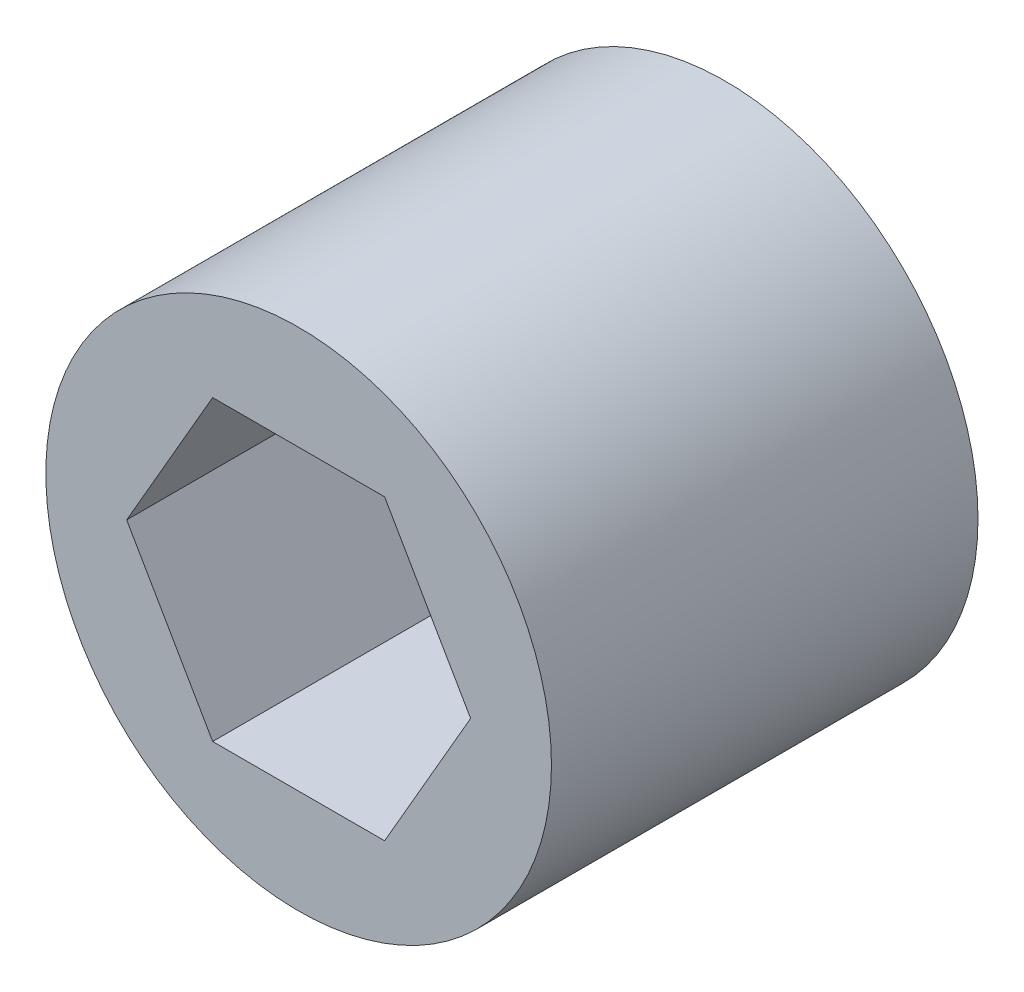
ISO-10303-21;
HEADER;
FILE_DESCRIPTION(('STEP AP214'),'2;1');
FILE_NAME('part.step','',(''),(''),'','','');
FILE_SCHEMA(('AUTOMOTIVE_DESIGN { 1 0 10303 214 1 1 1 1 }'));
ENDSEC;
DATA;
#1=APPLICATION_CONTEXT('core data for automotive mechanical design processes');
#2=APPLICATION_PROTOCOL_DEFINITION('international standard','automotive_design',2000,#1);
#3=PRODUCT_CONTEXT('',#1,'mechanical');
#4=PRODUCT('Part','Part','',(#3));
#5=PRODUCT_RELATED_PRODUCT_CATEGORY('part','',(#4));
#6=PRODUCT_DEFINITION_FORMATION('','',#4);
#7=PRODUCT_DEFINITION_CONTEXT('part definition',#1,'design');
#8=PRODUCT_DEFINITION('design','',#6,#7);
#9=PRODUCT_DEFINITION_SHAPE('','',#8);
#10=(LENGTH_UNIT() NAMED_UNIT(*) SI_UNIT(.MILLI.,.METRE.));
#11=(NAMED_UNIT(*) PLANE_ANGLE_UNIT() SI_UNIT($,.RADIAN.));
#12=(NAMED_UNIT(*) SI_UNIT($,.STERADIAN.) SOLID_ANGLE_UNIT());
#13=UNCERTAINTY_MEASURE_WITH_UNIT(LENGTH_MEASURE(1.E-05),#10,'distance_accuracy_value','');
#14=(GEOMETRIC_REPRESENTATION_CONTEXT(3) GLOBAL_UNCERTAINTY_ASSIGNED_CONTEXT((#13)) GLOBAL_UNIT_ASSIGNED_CONTEXT((#10,
#11,#12)) REPRESENTATION_CONTEXT('',''));
#15=CARTESIAN_POINT('',(0.,0.,0.));
#16=DIRECTION('',(0.,0.,1.));
#17=DIRECTION('',(1.,0.,0.));
#18=AXIS2_PLACEMENT_3D('',#15,#16,#17);
#19=CARTESIAN_POINT('',(0.,0.,14.732));
#20=DIRECTION('',(0.,0.,1.));
#21=DIRECTION('',(1.,0.,0.));
#22=AXIS2_PLACEMENT_3D('',#19,#20,#21);
#23=PLANE('',#22);
#24=CARTESIAN_POINT('',(0.,0.,14.732));
#25=DIRECTION('',(0.,0.,1.));
#26=DIRECTION('',(1.,0.,0.));
#27=AXIS2_PLACEMENT_3D('',#24,#25,#26);
#28=CIRCLE('',#27,8.73125);
#29=CARTESIAN_POINT('',(8.73125,0.,14.732));
#30=VERTEX_POINT('',#29);
#31=EDGE_CURVE('E11',#30,#30,#28,.T.);
#32=ORIENTED_EDGE('',*,*,#31,.T.);
#33=EDGE_LOOP('',(#32));
#34=FACE_BOUND('',#33,.T.);
#35=DIRECTION('',(-0.500000000000001,0.866025403784438,0.));
#36=VECTOR('',#35,1.);
#37=CARTESIAN_POINT('',(5.93920221915366,0.,14.732));
#38=LINE('',#37,#36);
#39=CARTESIAN_POINT('',(5.93920221915366,0.,14.732));
#40=VERTEX_POINT('',#39);
#41=CARTESIAN_POINT('',(2.96960110957682,5.14349999999999,14.732));
#42=VERTEX_POINT('',#41);
#43=EDGE_CURVE('E96',#40,#42,#38,.T.);
#44=ORIENTED_EDGE('',*,*,#43,.F.);
#45=DIRECTION('',(0.499999999999995,0.866025403784441,0.));
#46=VECTOR('',#45,1.);
#47=CARTESIAN_POINT('',(2.96960110957689,-5.14349999999995,14.732));
#48=LINE('',#47,#46);
#49=CARTESIAN_POINT('',(2.96960110957689,-5.14349999999995,14.732));
#50=VERTEX_POINT('',#49);
#51=EDGE_CURVE('E88',#50,#40,#48,.T.);
#52=ORIENTED_EDGE('',*,*,#51,.F.);
#53=DIRECTION('',(1.,0.,0.));
#54=VECTOR('',#53,1.);
#55=CARTESIAN_POINT('',(-2.96960110957678,-5.14350000000001,14.732));
#56=LINE('',#55,#54);
#57=CARTESIAN_POINT('',(-2.96960110957678,-5.14350000000001,14.732));
#58=VERTEX_POINT('',#57);
#59=EDGE_CURVE('E116',#58,#50,#56,.T.);
#60=ORIENTED_EDGE('',*,*,#59,.F.);
#61=DIRECTION('',(0.500000000000007,-0.866025403784434,0.));
#62=VECTOR('',#61,1.);
#63=CARTESIAN_POINT('',(-5.93920221915366,0.,14.732));
#64=LINE('',#63,#62);
#65=CARTESIAN_POINT('',(-5.93920221915366,0.,14.732));
#66=VERTEX_POINT('',#65);
#67=EDGE_CURVE('E114',#66,#58,#64,.T.);
#68=ORIENTED_EDGE('',*,*,#67,.F.);
#69=DIRECTION('',(-0.499999999999995,-0.866025403784441,0.));
#70=VECTOR('',#69,1.);
#71=CARTESIAN_POINT('',(-2.96960110957685,5.14349999999997,14.732));
#72=LINE('',#71,#70);
#73=CARTESIAN_POINT('',(-2.96960110957685,5.14349999999997,14.732));
#74=VERTEX_POINT('',#73);
#75=EDGE_CURVE('E110',#74,#66,#72,.T.);
#76=ORIENTED_EDGE('',*,*,#75,.F.);
#77=DIRECTION('',(-1.,0.,0.));
#78=VECTOR('',#77,1.);
#79=CARTESIAN_POINT('',(2.96960110957682,5.14349999999999,14.732));
#80=LINE('',#79,#78);
#81=EDGE_CURVE('E108',#42,#74,#80,.T.);
#82=ORIENTED_EDGE('',*,*,#81,.F.);
#83=EDGE_LOOP('',(#44,#52,#60,#68,#76,#82));
#84=FACE_BOUND('',#83,.T.);
#85=ADVANCED_FACE('F35',(#34,#84),#23,.T.);
#86=CARTESIAN_POINT('',(0.,0.,0.));
#87=DIRECTION('',(0.,0.,1.));
#88=DIRECTION('',(1.,0.,0.));
#89=AXIS2_PLACEMENT_3D('',#86,#87,#88);
#90=PLANE('',#89);
#91=CARTESIAN_POINT('',(0.,0.,0.));
#92=DIRECTION('',(0.,0.,1.));
#93=DIRECTION('',(1.,0.,0.));
#94=AXIS2_PLACEMENT_3D('',#91,#92,#93);
#95=CIRCLE('',#94,8.73125);
#96=CARTESIAN_POINT('',(8.73125,0.,0.));
#97=VERTEX_POINT('',#96);
#98=EDGE_CURVE('E39',#97,#97,#95,.T.);
#99=ORIENTED_EDGE('',*,*,#98,.F.);
#100=EDGE_LOOP('',(#99));
#101=FACE_BOUND('',#100,.T.);
#102=DIRECTION('',(0.499999999999995,0.866025403784441,0.));
#103=VECTOR('',#102,1.);
#104=CARTESIAN_POINT('',(2.96960110957689,-5.14349999999995,0.));
#105=LINE('',#104,#103);
#106=CARTESIAN_POINT('',(2.96960110957689,-5.14349999999995,0.));
#107=VERTEX_POINT('',#106);
#108=CARTESIAN_POINT('',(5.93920221915366,0.,0.));
#109=VERTEX_POINT('',#108);
#110=EDGE_CURVE('E58',#107,#109,#105,.T.);
#111=ORIENTED_EDGE('',*,*,#110,.T.);
#112=DIRECTION('',(-0.500000000000001,0.866025403784438,0.));
#113=VECTOR('',#112,1.);
#114=CARTESIAN_POINT('',(5.93920221915366,0.,0.));
#115=LINE('',#114,#113);
#116=CARTESIAN_POINT('',(2.96960110957682,5.14349999999999,0.));
#117=VERTEX_POINT('',#116);
#118=EDGE_CURVE('E103',#109,#117,#115,.T.);
#119=ORIENTED_EDGE('',*,*,#118,.T.);
#120=DIRECTION('',(-1.,0.,0.));
#121=VECTOR('',#120,1.);
#122=CARTESIAN_POINT('',(2.96960110957682,5.14349999999999,0.));
#123=LINE('',#122,#121);
#124=CARTESIAN_POINT('',(-2.96960110957685,5.14349999999997,0.));
#125=VERTEX_POINT('',#124);
#126=EDGE_CURVE('E120',#117,#125,#123,.T.);
#127=ORIENTED_EDGE('',*,*,#126,.T.);
#128=DIRECTION('',(-0.499999999999995,-0.866025403784441,0.));
#129=VECTOR('',#128,1.);
#130=CARTESIAN_POINT('',(-2.96960110957685,5.14349999999997,0.));
#131=LINE('',#130,#129);
#132=CARTESIAN_POINT('',(-5.93920221915366,0.,0.));
#133=VERTEX_POINT('',#132);
#134=EDGE_CURVE('E123',#125,#133,#131,.T.);
#135=ORIENTED_EDGE('',*,*,#134,.T.);
#136=DIRECTION('',(0.500000000000007,-0.866025403784434,0.));
#137=VECTOR('',#136,1.);
#138=CARTESIAN_POINT('',(-5.93920221915366,0.,0.));
#139=LINE('',#138,#137);
#140=CARTESIAN_POINT('',(-2.96960110957678,-5.14350000000001,0.));
#141=VERTEX_POINT('',#140);
#142=EDGE_CURVE('E126',#133,#141,#139,.T.);
#143=ORIENTED_EDGE('',*,*,#142,.T.);
#144=DIRECTION('',(1.,0.,0.));
#145=VECTOR('',#144,1.);
#146=CARTESIAN_POINT('',(-2.96960110957678,-5.14350000000001,0.));
#147=LINE('',#146,#145);
#148=EDGE_CURVE('E97',#141,#107,#147,.T.);
#149=ORIENTED_EDGE('',*,*,#148,.T.);
#150=EDGE_LOOP('',(#111,#119,#127,#135,#143,#149));
#151=FACE_BOUND('',#150,.T.);
#152=ADVANCED_FACE('F143',(#101,#151),#90,.F.);
#153=CARTESIAN_POINT('',(0.,0.,14.732));
#154=DIRECTION('',(0.,0.,-1.));
#155=DIRECTION('',(-1.,0.,0.));
#156=AXIS2_PLACEMENT_3D('',#153,#154,#155);
#157=CYLINDRICAL_SURFACE('',#156,8.73125);
#158=ORIENTED_EDGE('',*,*,#31,.F.);
#159=EDGE_LOOP('',(#158));
#160=FACE_BOUND('',#159,.T.);
#161=ORIENTED_EDGE('',*,*,#98,.T.);
#162=EDGE_LOOP('',(#161));
#163=FACE_BOUND('',#162,.T.);
#164=ADVANCED_FACE('F37',(#160,#163),#157,.T.);
#165=CARTESIAN_POINT('',(2.96960110957689,-5.14349999999995,14.732));
#166=DIRECTION('',(-0.866025403784442,0.499999999999995,0.));
#167=DIRECTION('',(-0.499999999999995,-0.866025403784441,0.));
#168=AXIS2_PLACEMENT_3D('',#165,#166,#167);
#169=PLANE('',#168);
#170=ORIENTED_EDGE('',*,*,#110,.F.);
#171=DIRECTION('',(0.,0.,-1.));
#172=VECTOR('',#171,1.);
#173=CARTESIAN_POINT('',(2.96960110957689,-5.14349999999995,14.732));
#174=LINE('',#173,#172);
#175=EDGE_CURVE('E92',#50,#107,#174,.T.);
#176=ORIENTED_EDGE('',*,*,#175,.F.);
#177=ORIENTED_EDGE('',*,*,#51,.T.);
#178=DIRECTION('',(0.,0.,-1.));
#179=VECTOR('',#178,1.);
#180=CARTESIAN_POINT('',(5.93920221915366,0.,14.732));
#181=LINE('',#180,#179);
#182=EDGE_CURVE('E91',#40,#109,#181,.T.);
#183=ORIENTED_EDGE('',*,*,#182,.T.);
#184=EDGE_LOOP('',(#170,#176,#177,#183));
#185=FACE_BOUND('',#184,.T.);
#186=ADVANCED_FACE('F90',(#185),#169,.T.);
#187=CARTESIAN_POINT('',(5.93920221915366,0.,14.732));
#188=DIRECTION('',(-0.866025403784438,-0.500000000000001,0.));
#189=DIRECTION('',(0.500000000000001,-0.866025403784438,0.));
#190=AXIS2_PLACEMENT_3D('',#187,#188,#189);
#191=PLANE('',#190);
#192=ORIENTED_EDGE('',*,*,#118,.F.);
#193=ORIENTED_EDGE('',*,*,#182,.F.);
#194=ORIENTED_EDGE('',*,*,#43,.T.);
#195=DIRECTION('',(0.,0.,-1.));
#196=VECTOR('',#195,1.);
#197=CARTESIAN_POINT('',(2.96960110957682,5.14349999999999,14.732));
#198=LINE('',#197,#196);
#199=EDGE_CURVE('E104',#42,#117,#198,.T.);
#200=ORIENTED_EDGE('',*,*,#199,.T.);
#201=EDGE_LOOP('',(#192,#193,#194,#200));
#202=FACE_BOUND('',#201,.T.);
#203=ADVANCED_FACE('F100',(#202),#191,.T.);
#204=CARTESIAN_POINT('',(2.96960110957682,5.14349999999999,14.732));
#205=DIRECTION('',(0.,-1.,0.));
#206=DIRECTION('',(1.,0.,0.));
#207=AXIS2_PLACEMENT_3D('',#204,#205,#206);
#208=PLANE('',#207);
#209=ORIENTED_EDGE('',*,*,#126,.F.);
#210=ORIENTED_EDGE('',*,*,#199,.F.);
#211=ORIENTED_EDGE('',*,*,#81,.T.);
#212=DIRECTION('',(0.,0.,-1.));
#213=VECTOR('',#212,1.);
#214=CARTESIAN_POINT('',(-2.96960110957685,5.14349999999997,14.732));
#215=LINE('',#214,#213);
#216=EDGE_CURVE('E135',#74,#125,#215,.T.);
#217=ORIENTED_EDGE('',*,*,#216,.T.);
#218=EDGE_LOOP('',(#209,#210,#211,#217));
#219=FACE_BOUND('',#218,.T.);
#220=ADVANCED_FACE('F139',(#219),#208,.T.);
#221=CARTESIAN_POINT('',(-2.96960110957685,5.14349999999997,14.732));
#222=DIRECTION('',(0.866025403784442,-0.499999999999995,0.));
#223=DIRECTION('',(0.499999999999995,0.866025403784441,0.));
#224=AXIS2_PLACEMENT_3D('',#221,#222,#223);
#225=PLANE('',#224);
#226=ORIENTED_EDGE('',*,*,#134,.F.);
#227=ORIENTED_EDGE('',*,*,#216,.F.);
#228=ORIENTED_EDGE('',*,*,#75,.T.);
#229=DIRECTION('',(0.,0.,-1.));
#230=VECTOR('',#229,1.);
#231=CARTESIAN_POINT('',(-5.93920221915366,0.,14.732));
#232=LINE('',#231,#230);
#233=EDGE_CURVE('E133',#66,#133,#232,.T.);
#234=ORIENTED_EDGE('',*,*,#233,.T.);
#235=EDGE_LOOP('',(#226,#227,#228,#234));
#236=FACE_BOUND('',#235,.T.);
#237=ADVANCED_FACE('F151',(#236),#225,.T.);
#238=CARTESIAN_POINT('',(-5.93920221915366,0.,14.732));
#239=DIRECTION('',(0.866025403784435,0.500000000000007,0.));
#240=DIRECTION('',(-0.500000000000007,0.866025403784435,0.));
#241=AXIS2_PLACEMENT_3D('',#238,#239,#240);
#242=PLANE('',#241);
#243=ORIENTED_EDGE('',*,*,#142,.F.);
#244=ORIENTED_EDGE('',*,*,#233,.F.);
#245=ORIENTED_EDGE('',*,*,#67,.T.);
#246=DIRECTION('',(0.,0.,-1.));
#247=VECTOR('',#246,1.);
#248=CARTESIAN_POINT('',(-2.96960110957678,-5.14350000000001,14.732));
#249=LINE('',#248,#247);
#250=EDGE_CURVE('E50',#58,#141,#249,.T.);
#251=ORIENTED_EDGE('',*,*,#250,.T.);
#252=EDGE_LOOP('',(#243,#244,#245,#251));
#253=FACE_BOUND('',#252,.T.);
#254=ADVANCED_FACE('F149',(#253),#242,.T.);
#255=CARTESIAN_POINT('',(-2.96960110957678,-5.14350000000001,14.732));
#256=DIRECTION('',(0.,1.,0.));
#257=DIRECTION('',(-1.,0.,0.));
#258=AXIS2_PLACEMENT_3D('',#255,#256,#257);
#259=PLANE('',#258);
#260=ORIENTED_EDGE('',*,*,#148,.F.);
#261=ORIENTED_EDGE('',*,*,#250,.F.);
#262=ORIENTED_EDGE('',*,*,#59,.T.);
#263=ORIENTED_EDGE('',*,*,#175,.T.);
#264=EDGE_LOOP('',(#260,#261,#262,#263));
#265=FACE_BOUND('',#264,.T.);
#266=ADVANCED_FACE('F145',(#265),#259,.T.);
#267=CLOSED_SHELL('',(#85,#152,#164,#186,#203,#220,#237,#254,#266));
#268=MANIFOLD_SOLID_BREP('B2',#267);
#269=ADVANCED_BREP_SHAPE_REPRESENTATION('',(#18,#268),#14);
#270=SHAPE_DEFINITION_REPRESENTATION(#9,#269);
ENDSEC;
END-ISO-10303-21;
